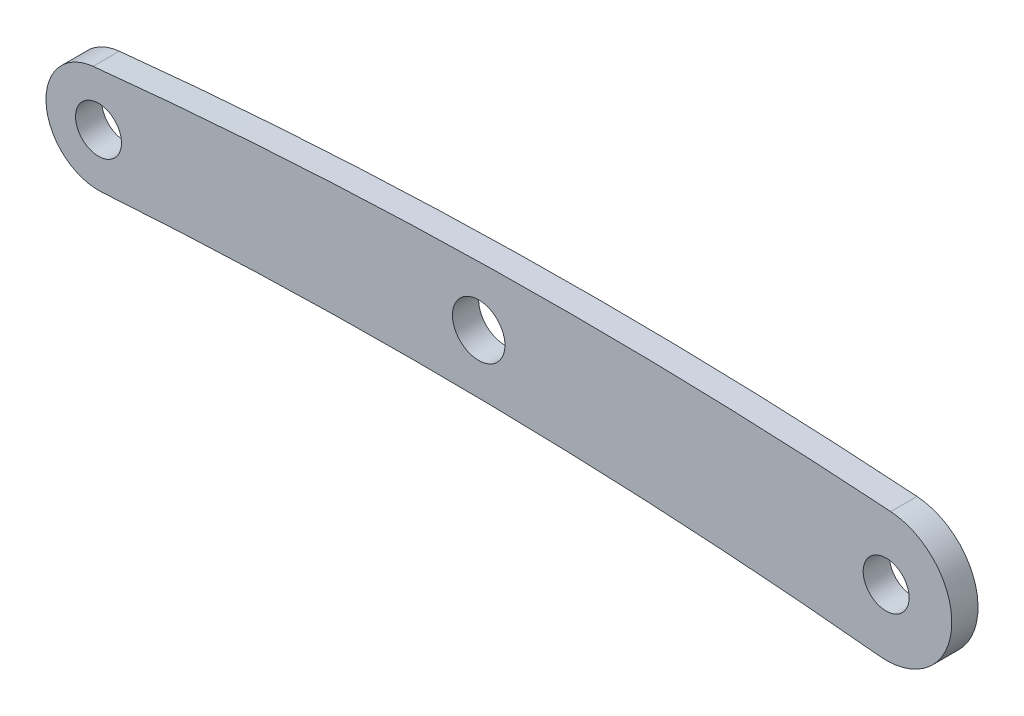
ISO-10303-21;
HEADER;
FILE_DESCRIPTION(('STEP AP214'),'2;1');
FILE_NAME('part.step','',(''),(''),'','','');
FILE_SCHEMA(('AUTOMOTIVE_DESIGN { 1 0 10303 214 1 1 1 1 }'));
ENDSEC;
DATA;
#1=APPLICATION_CONTEXT('core data for automotive mechanical design processes');
#2=APPLICATION_PROTOCOL_DEFINITION('international standard','automotive_design',2000,#1);
#3=PRODUCT_CONTEXT('',#1,'mechanical');
#4=PRODUCT('Part','Part','',(#3));
#5=PRODUCT_RELATED_PRODUCT_CATEGORY('part','',(#4));
#6=PRODUCT_DEFINITION_FORMATION('','',#4);
#7=PRODUCT_DEFINITION_CONTEXT('part definition',#1,'design');
#8=PRODUCT_DEFINITION('design','',#6,#7);
#9=PRODUCT_DEFINITION_SHAPE('','',#8);
#10=(LENGTH_UNIT() NAMED_UNIT(*) SI_UNIT(.MILLI.,.METRE.));
#11=(NAMED_UNIT(*) PLANE_ANGLE_UNIT() SI_UNIT($,.RADIAN.));
#12=(NAMED_UNIT(*) SI_UNIT($,.STERADIAN.) SOLID_ANGLE_UNIT());
#13=UNCERTAINTY_MEASURE_WITH_UNIT(LENGTH_MEASURE(1.E-05),#10,'distance_accuracy_value','');
#14=(GEOMETRIC_REPRESENTATION_CONTEXT(3) GLOBAL_UNCERTAINTY_ASSIGNED_CONTEXT((#13)) GLOBAL_UNIT_ASSIGNED_CONTEXT((#10,
#11,#12)) REPRESENTATION_CONTEXT('',''));
#15=CARTESIAN_POINT('',(0.,0.,0.));
#16=DIRECTION('',(0.,0.,1.));
#17=DIRECTION('',(1.,0.,0.));
#18=AXIS2_PLACEMENT_3D('',#15,#16,#17);
#19=CARTESIAN_POINT('',(12.0458333333333,-176.589631347102,2.));
#20=DIRECTION('',(0.,0.,1.));
#21=DIRECTION('',(1.,0.,0.));
#22=AXIS2_PLACEMENT_3D('',#19,#20,#21);
#23=PLANE('',#22);
#24=CARTESIAN_POINT('',(28.9610504483033,1.26174993205025,2.));
#25=DIRECTION('',(0.,0.,1.));
#26=DIRECTION('',(1.,0.,0.));
#27=AXIS2_PLACEMENT_3D('',#24,#25,#26);
#28=CIRCLE('',#27,2.);
#29=CARTESIAN_POINT('',(30.9610504483033,1.26174993205025,2.));
#30=VERTEX_POINT('',#29);
#31=EDGE_CURVE('E133',#30,#30,#28,.T.);
#32=ORIENTED_EDGE('',*,*,#31,.F.);
#33=EDGE_LOOP('',(#32));
#34=FACE_BOUND('',#33,.T.);
#35=CARTESIAN_POINT('',(0.,0.,2.));
#36=DIRECTION('',(0.,0.,1.));
#37=DIRECTION('',(1.,0.,0.));
#38=AXIS2_PLACEMENT_3D('',#35,#36,#37);
#39=CIRCLE('',#38,1.75);
#40=CARTESIAN_POINT('',(1.75,0.,2.));
#41=VERTEX_POINT('',#40);
#42=EDGE_CURVE('E110',#41,#41,#39,.T.);
#43=ORIENTED_EDGE('',*,*,#42,.F.);
#44=EDGE_LOOP('',(#43));
#45=FACE_BOUND('',#44,.T.);
#46=CARTESIAN_POINT('',(24.0916666666665,-353.179262694205,2.));
#47=DIRECTION('',(0.,0.,-1.));
#48=DIRECTION('',(1.,0.,0.));
#49=AXIS2_PLACEMENT_3D('',#46,#47,#48);
#50=CIRCLE('',#49,350.);
#51=CARTESIAN_POINT('',(0.272222222222217,-3.99072613213789,2.));
#52=VERTEX_POINT('',#51);
#53=CARTESIAN_POINT('',(59.4942488262911,-4.97435581259441,2.));
#54=VERTEX_POINT('',#53);
#55=EDGE_CURVE('E94',#52,#54,#50,.T.);
#56=ORIENTED_EDGE('',*,*,#55,.T.);
#57=CARTESIAN_POINT('',(60.,0.,2.));
#58=DIRECTION('',(0.,0.,1.));
#59=DIRECTION('',(1.,0.,0.));
#60=AXIS2_PLACEMENT_3D('',#57,#58,#59);
#61=CIRCLE('',#60,4.99999999999998);
#62=CARTESIAN_POINT('',(60.3513285024155,4.98764155522335,2.));
#63=VERTEX_POINT('',#62);
#64=EDGE_CURVE('E89',#54,#63,#61,.T.);
#65=ORIENTED_EDGE('',*,*,#64,.T.);
#66=CARTESIAN_POINT('',(35.7583333333333,-344.147267310409,2.));
#67=DIRECTION('',(0.,0.,1.));
#68=DIRECTION('',(1.,0.,0.));
#69=AXIS2_PLACEMENT_3D('',#66,#67,#68);
#70=CIRCLE('',#69,350.);
#71=CARTESIAN_POINT('',(-0.413391136801539,3.97858112497581,2.));
#72=VERTEX_POINT('',#71);
#73=EDGE_CURVE('E92',#63,#72,#70,.T.);
#74=ORIENTED_EDGE('',*,*,#73,.T.);
#75=CARTESIAN_POINT('',(0.,0.,2.));
#76=DIRECTION('',(0.,0.,1.));
#77=DIRECTION('',(1.,0.,0.));
#78=AXIS2_PLACEMENT_3D('',#75,#76,#77);
#79=CIRCLE('',#78,3.99999999999998);
#80=EDGE_CURVE('E59',#72,#52,#79,.T.);
#81=ORIENTED_EDGE('',*,*,#80,.T.);
#82=EDGE_LOOP('',(#56,#65,#74,#81));
#83=FACE_BOUND('',#82,.T.);
#84=CARTESIAN_POINT('',(60.,0.,2.));
#85=DIRECTION('',(0.,0.,1.));
#86=DIRECTION('',(1.,0.,0.));
#87=AXIS2_PLACEMENT_3D('',#84,#85,#86);
#88=CIRCLE('',#87,1.75);
#89=CARTESIAN_POINT('',(61.75,0.,2.));
#90=VERTEX_POINT('',#89);
#91=EDGE_CURVE('E125',#90,#90,#88,.T.);
#92=ORIENTED_EDGE('',*,*,#91,.F.);
#93=EDGE_LOOP('',(#92));
#94=FACE_BOUND('',#93,.T.);
#95=ADVANCED_FACE('F41',(#34,#45,#83,#94),#23,.T.);
#96=CARTESIAN_POINT('',(12.0458333333333,-176.589631347102,0.));
#97=DIRECTION('',(0.,0.,1.));
#98=DIRECTION('',(1.,0.,0.));
#99=AXIS2_PLACEMENT_3D('',#96,#97,#98);
#100=PLANE('',#99);
#101=CARTESIAN_POINT('',(28.9610504483033,1.26174993205025,0.));
#102=DIRECTION('',(0.,0.,1.));
#103=DIRECTION('',(1.,0.,0.));
#104=AXIS2_PLACEMENT_3D('',#101,#102,#103);
#105=CIRCLE('',#104,2.);
#106=CARTESIAN_POINT('',(30.9610504483033,1.26174993205025,0.));
#107=VERTEX_POINT('',#106);
#108=EDGE_CURVE('E45',#107,#107,#105,.T.);
#109=ORIENTED_EDGE('',*,*,#108,.T.);
#110=EDGE_LOOP('',(#109));
#111=FACE_BOUND('',#110,.T.);
#112=CARTESIAN_POINT('',(24.0916666666665,-353.179262694205,0.));
#113=DIRECTION('',(0.,0.,-1.));
#114=DIRECTION('',(1.,0.,0.));
#115=AXIS2_PLACEMENT_3D('',#112,#113,#114);
#116=CIRCLE('',#115,350.);
#117=CARTESIAN_POINT('',(0.272222222222217,-3.99072613213789,0.));
#118=VERTEX_POINT('',#117);
#119=CARTESIAN_POINT('',(59.4942488262911,-4.97435581259441,0.));
#120=VERTEX_POINT('',#119);
#121=EDGE_CURVE('E107',#118,#120,#116,.T.);
#122=ORIENTED_EDGE('',*,*,#121,.F.);
#123=CARTESIAN_POINT('',(0.,0.,0.));
#124=DIRECTION('',(0.,0.,1.));
#125=DIRECTION('',(1.,0.,0.));
#126=AXIS2_PLACEMENT_3D('',#123,#124,#125);
#127=CIRCLE('',#126,3.99999999999998);
#128=CARTESIAN_POINT('',(-0.413391136801539,3.97858112497581,0.));
#129=VERTEX_POINT('',#128);
#130=EDGE_CURVE('E82',#129,#118,#127,.T.);
#131=ORIENTED_EDGE('',*,*,#130,.F.);
#132=CARTESIAN_POINT('',(35.7583333333333,-344.147267310409,0.));
#133=DIRECTION('',(0.,0.,1.));
#134=DIRECTION('',(1.,0.,0.));
#135=AXIS2_PLACEMENT_3D('',#132,#133,#134);
#136=CIRCLE('',#135,350.);
#137=CARTESIAN_POINT('',(60.3513285024155,4.98764155522335,0.));
#138=VERTEX_POINT('',#137);
#139=EDGE_CURVE('E76',#138,#129,#136,.T.);
#140=ORIENTED_EDGE('',*,*,#139,.F.);
#141=CARTESIAN_POINT('',(60.,0.,0.));
#142=DIRECTION('',(0.,0.,1.));
#143=DIRECTION('',(1.,0.,0.));
#144=AXIS2_PLACEMENT_3D('',#141,#142,#143);
#145=CIRCLE('',#144,4.99999999999998);
#146=EDGE_CURVE('E98',#120,#138,#145,.T.);
#147=ORIENTED_EDGE('',*,*,#146,.F.);
#148=EDGE_LOOP('',(#122,#131,#140,#147));
#149=FACE_BOUND('',#148,.T.);
#150=CARTESIAN_POINT('',(0.,0.,0.));
#151=DIRECTION('',(0.,0.,1.));
#152=DIRECTION('',(1.,0.,0.));
#153=AXIS2_PLACEMENT_3D('',#150,#151,#152);
#154=CIRCLE('',#153,1.75);
#155=CARTESIAN_POINT('',(1.75,0.,0.));
#156=VERTEX_POINT('',#155);
#157=EDGE_CURVE('E122',#156,#156,#154,.T.);
#158=ORIENTED_EDGE('',*,*,#157,.T.);
#159=EDGE_LOOP('',(#158));
#160=FACE_BOUND('',#159,.T.);
#161=CARTESIAN_POINT('',(60.,0.,0.));
#162=DIRECTION('',(0.,0.,1.));
#163=DIRECTION('',(1.,0.,0.));
#164=AXIS2_PLACEMENT_3D('',#161,#162,#163);
#165=CIRCLE('',#164,1.75);
#166=CARTESIAN_POINT('',(61.75,0.,0.));
#167=VERTEX_POINT('',#166);
#168=EDGE_CURVE('E128',#167,#167,#165,.T.);
#169=ORIENTED_EDGE('',*,*,#168,.T.);
#170=EDGE_LOOP('',(#169));
#171=FACE_BOUND('',#170,.T.);
#172=ADVANCED_FACE('F118',(#111,#149,#160,#171),#100,.F.);
#173=CARTESIAN_POINT('',(24.0916666666665,-353.179262694205,2.));
#174=DIRECTION('',(0.,0.,-1.));
#175=DIRECTION('',(-1.,0.,0.));
#176=AXIS2_PLACEMENT_3D('',#173,#174,#175);
#177=CYLINDRICAL_SURFACE('',#176,350.);
#178=ORIENTED_EDGE('',*,*,#121,.T.);
#179=DIRECTION('',(0.,0.,-1.));
#180=VECTOR('',#179,1.);
#181=CARTESIAN_POINT('',(59.4942488262911,-4.97435581259441,2.));
#182=LINE('',#181,#180);
#183=EDGE_CURVE('E11',#54,#120,#182,.T.);
#184=ORIENTED_EDGE('',*,*,#183,.F.);
#185=ORIENTED_EDGE('',*,*,#55,.F.);
#186=DIRECTION('',(0.,0.,-1.));
#187=VECTOR('',#186,1.);
#188=CARTESIAN_POINT('',(0.272222222222217,-3.99072613213789,2.));
#189=LINE('',#188,#187);
#190=EDGE_CURVE('E103',#52,#118,#189,.T.);
#191=ORIENTED_EDGE('',*,*,#190,.T.);
#192=EDGE_LOOP('',(#178,#184,#185,#191));
#193=FACE_BOUND('',#192,.T.);
#194=ADVANCED_FACE('F43',(#193),#177,.F.);
#195=CARTESIAN_POINT('',(60.,0.,2.));
#196=DIRECTION('',(0.,0.,-1.));
#197=DIRECTION('',(-1.,0.,0.));
#198=AXIS2_PLACEMENT_3D('',#195,#196,#197);
#199=CYLINDRICAL_SURFACE('',#198,4.99999999999998);
#200=ORIENTED_EDGE('',*,*,#146,.T.);
#201=DIRECTION('',(0.,0.,-1.));
#202=VECTOR('',#201,1.);
#203=CARTESIAN_POINT('',(60.3513285024155,4.98764155522335,2.));
#204=LINE('',#203,#202);
#205=EDGE_CURVE('E51',#63,#138,#204,.T.);
#206=ORIENTED_EDGE('',*,*,#205,.F.);
#207=ORIENTED_EDGE('',*,*,#64,.F.);
#208=ORIENTED_EDGE('',*,*,#183,.T.);
#209=EDGE_LOOP('',(#200,#206,#207,#208));
#210=FACE_BOUND('',#209,.T.);
#211=ADVANCED_FACE('F97',(#210),#199,.T.);
#212=CARTESIAN_POINT('',(35.7583333333333,-344.147267310409,2.));
#213=DIRECTION('',(0.,0.,-1.));
#214=DIRECTION('',(-1.,0.,0.));
#215=AXIS2_PLACEMENT_3D('',#212,#213,#214);
#216=CYLINDRICAL_SURFACE('',#215,350.);
#217=ORIENTED_EDGE('',*,*,#139,.T.);
#218=DIRECTION('',(0.,0.,-1.));
#219=VECTOR('',#218,1.);
#220=CARTESIAN_POINT('',(-0.413391136801539,3.97858112497581,2.));
#221=LINE('',#220,#219);
#222=EDGE_CURVE('E99',#72,#129,#221,.T.);
#223=ORIENTED_EDGE('',*,*,#222,.F.);
#224=ORIENTED_EDGE('',*,*,#73,.F.);
#225=ORIENTED_EDGE('',*,*,#205,.T.);
#226=EDGE_LOOP('',(#217,#223,#224,#225));
#227=FACE_BOUND('',#226,.T.);
#228=ADVANCED_FACE('F101',(#227),#216,.T.);
#229=CARTESIAN_POINT('',(0.,0.,2.));
#230=DIRECTION('',(0.,0.,-1.));
#231=DIRECTION('',(-1.,0.,0.));
#232=AXIS2_PLACEMENT_3D('',#229,#230,#231);
#233=CYLINDRICAL_SURFACE('',#232,3.99999999999998);
#234=ORIENTED_EDGE('',*,*,#130,.T.);
#235=ORIENTED_EDGE('',*,*,#190,.F.);
#236=ORIENTED_EDGE('',*,*,#80,.F.);
#237=ORIENTED_EDGE('',*,*,#222,.T.);
#238=EDGE_LOOP('',(#234,#235,#236,#237));
#239=FACE_BOUND('',#238,.T.);
#240=ADVANCED_FACE('F115',(#239),#233,.T.);
#241=CARTESIAN_POINT('',(0.,0.,2.));
#242=DIRECTION('',(0.,0.,-1.));
#243=DIRECTION('',(-1.,0.,0.));
#244=AXIS2_PLACEMENT_3D('',#241,#242,#243);
#245=CYLINDRICAL_SURFACE('',#244,1.75);
#246=ORIENTED_EDGE('',*,*,#42,.T.);
#247=EDGE_LOOP('',(#246));
#248=FACE_BOUND('',#247,.T.);
#249=ORIENTED_EDGE('',*,*,#157,.F.);
#250=EDGE_LOOP('',(#249));
#251=FACE_BOUND('',#250,.T.);
#252=ADVANCED_FACE('F149',(#248,#251),#245,.F.);
#253=CARTESIAN_POINT('',(60.,0.,2.));
#254=DIRECTION('',(0.,0.,-1.));
#255=DIRECTION('',(-1.,0.,0.));
#256=AXIS2_PLACEMENT_3D('',#253,#254,#255);
#257=CYLINDRICAL_SURFACE('',#256,1.75);
#258=ORIENTED_EDGE('',*,*,#91,.T.);
#259=EDGE_LOOP('',(#258));
#260=FACE_BOUND('',#259,.T.);
#261=ORIENTED_EDGE('',*,*,#168,.F.);
#262=EDGE_LOOP('',(#261));
#263=FACE_BOUND('',#262,.T.);
#264=ADVANCED_FACE('F143',(#260,#263),#257,.F.);
#265=CARTESIAN_POINT('',(28.9610504483033,1.26174993205025,-8.));
#266=DIRECTION('',(0.,0.,1.));
#267=DIRECTION('',(1.,0.,0.));
#268=AXIS2_PLACEMENT_3D('',#265,#266,#267);
#269=CYLINDRICAL_SURFACE('',#268,2.);
#270=ORIENTED_EDGE('',*,*,#31,.T.);
#271=EDGE_LOOP('',(#270));
#272=FACE_BOUND('',#271,.T.);
#273=ORIENTED_EDGE('',*,*,#108,.F.);
#274=EDGE_LOOP('',(#273));
#275=FACE_BOUND('',#274,.T.);
#276=ADVANCED_FACE('F141',(#272,#275),#269,.F.);
#277=CLOSED_SHELL('',(#95,#172,#194,#211,#228,#240,#252,#264,#276));
#278=MANIFOLD_SOLID_BREP('B2',#277);
#279=ADVANCED_BREP_SHAPE_REPRESENTATION('',(#18,#278),#14);
#280=SHAPE_DEFINITION_REPRESENTATION(#9,#279);
ENDSEC;
END-ISO-10303-21;
